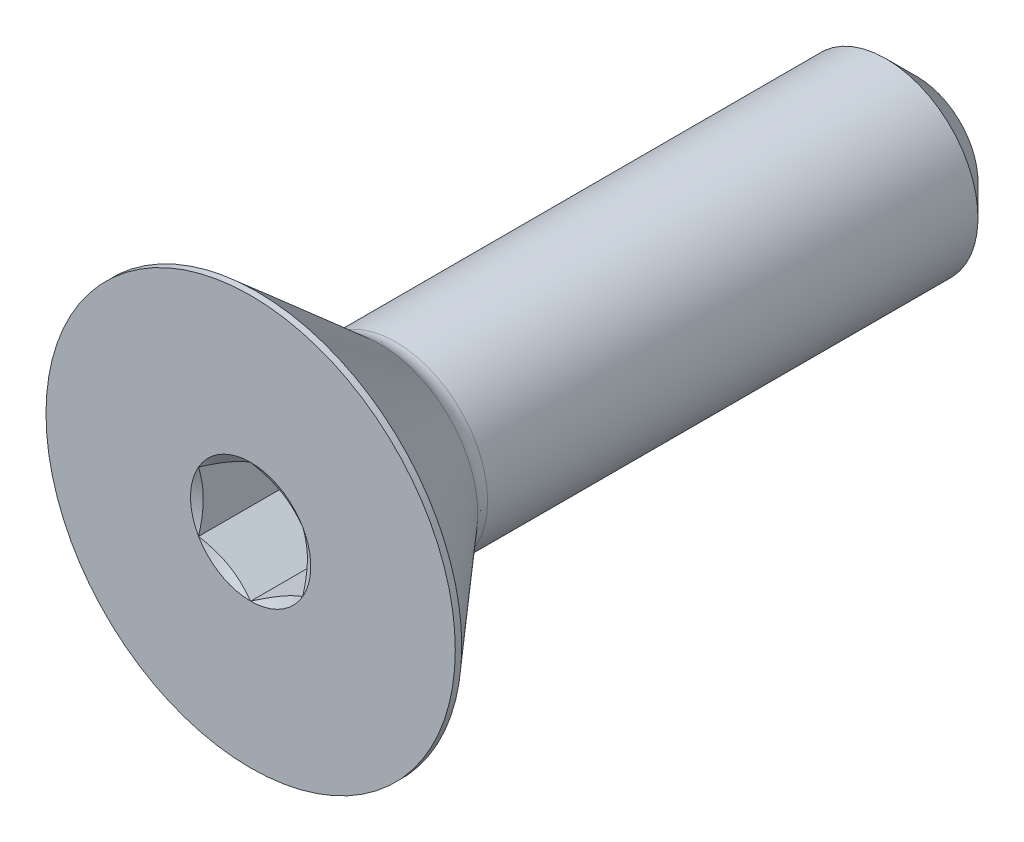
ISO-10303-21;
HEADER;
FILE_DESCRIPTION(('STEP AP214'),'2;1');
FILE_NAME('part.step','',(''),(''),'','','');
FILE_SCHEMA(('AUTOMOTIVE_DESIGN { 1 0 10303 214 1 1 1 1 }'));
ENDSEC;
DATA;
#1=APPLICATION_CONTEXT('core data for automotive mechanical design processes');
#2=APPLICATION_PROTOCOL_DEFINITION('international standard','automotive_design',2000,#1);
#3=PRODUCT_CONTEXT('',#1,'mechanical');
#4=PRODUCT('Part','Part','',(#3));
#5=PRODUCT_RELATED_PRODUCT_CATEGORY('part','',(#4));
#6=PRODUCT_DEFINITION_FORMATION('','',#4);
#7=PRODUCT_DEFINITION_CONTEXT('part definition',#1,'design');
#8=PRODUCT_DEFINITION('design','',#6,#7);
#9=PRODUCT_DEFINITION_SHAPE('','',#8);
#10=(LENGTH_UNIT() NAMED_UNIT(*) SI_UNIT(.MILLI.,.METRE.));
#11=(NAMED_UNIT(*) PLANE_ANGLE_UNIT() SI_UNIT($,.RADIAN.));
#12=(NAMED_UNIT(*) SI_UNIT($,.STERADIAN.) SOLID_ANGLE_UNIT());
#13=UNCERTAINTY_MEASURE_WITH_UNIT(LENGTH_MEASURE(1.E-05),#10,'distance_accuracy_value','');
#14=(GEOMETRIC_REPRESENTATION_CONTEXT(3) GLOBAL_UNCERTAINTY_ASSIGNED_CONTEXT((#13)) GLOBAL_UNIT_ASSIGNED_CONTEXT((#10,
#11,#12)) REPRESENTATION_CONTEXT('',''));
#15=CARTESIAN_POINT('',(0.,0.,0.));
#16=DIRECTION('',(0.,0.,1.));
#17=DIRECTION('',(1.,0.,0.));
#18=AXIS2_PLACEMENT_3D('',#15,#16,#17);
#19=CARTESIAN_POINT('',(0.,0.,-12.7));
#20=DIRECTION('',(0.,0.,-1.));
#21=DIRECTION('',(0.,1.,0.));
#22=AXIS2_PLACEMENT_3D('',#19,#20,#21);
#23=CYLINDRICAL_SURFACE('',#22,1.7526);
#24=CARTESIAN_POINT('',(0.,0.,-12.1046875));
#25=DIRECTION('',(0.,0.,-1.));
#26=DIRECTION('',(0.,1.,0.));
#27=AXIS2_PLACEMENT_3D('',#24,#25,#26);
#28=CIRCLE('',#27,1.7526);
#29=CARTESIAN_POINT('',(0.,1.7526,-12.1046875));
#30=VERTEX_POINT('',#29);
#31=EDGE_CURVE('E48',#30,#30,#28,.F.);
#32=ORIENTED_EDGE('',*,*,#31,.T.);
#33=EDGE_LOOP('',(#32));
#34=FACE_BOUND('',#33,.T.);
#35=CARTESIAN_POINT('',(0.,0.,-2.76239145005296));
#36=DIRECTION('',(0.,0.,1.));
#37=DIRECTION('',(0.,-1.,0.));
#38=AXIS2_PLACEMENT_3D('',#35,#36,#37);
#39=CIRCLE('',#38,1.7526);
#40=CARTESIAN_POINT('',(0.,-1.7526,-2.76239145005296));
#41=VERTEX_POINT('',#40);
#42=EDGE_CURVE('E207',#41,#41,#39,.T.);
#43=ORIENTED_EDGE('',*,*,#42,.F.);
#44=EDGE_LOOP('',(#43));
#45=FACE_BOUND('',#44,.T.);
#46=ADVANCED_FACE('F35',(#34,#45),#23,.T.);
#47=CARTESIAN_POINT('',(0.,-1.7526,-12.7));
#48=DIRECTION('',(0.,0.,-1.));
#49=DIRECTION('',(0.,1.,0.));
#50=AXIS2_PLACEMENT_3D('',#47,#48,#49);
#51=PLANE('',#50);
#52=CARTESIAN_POINT('',(0.,0.,-12.7));
#53=DIRECTION('',(0.,0.,-1.));
#54=DIRECTION('',(0.,1.,0.));
#55=AXIS2_PLACEMENT_3D('',#52,#53,#54);
#56=CIRCLE('',#55,1.1572875);
#57=CARTESIAN_POINT('',(0.,1.1572875,-12.7));
#58=VERTEX_POINT('',#57);
#59=EDGE_CURVE('E210',#58,#58,#56,.T.);
#60=ORIENTED_EDGE('',*,*,#59,.T.);
#61=EDGE_LOOP('',(#60));
#62=FACE_BOUND('',#61,.T.);
#63=ADVANCED_FACE('F220',(#62),#51,.T.);
#64=CARTESIAN_POINT('',(0.,0.,-12.7));
#65=DIRECTION('',(0.,0.,1.));
#66=DIRECTION('',(0.,-1.,0.));
#67=AXIS2_PLACEMENT_3D('',#64,#65,#66);
#68=CONICAL_SURFACE('',#67,1.1572875,0.785398163397447);
#69=ORIENTED_EDGE('',*,*,#31,.F.);
#70=EDGE_LOOP('',(#69));
#71=FACE_BOUND('',#70,.T.);
#72=ORIENTED_EDGE('',*,*,#59,.F.);
#73=EDGE_LOOP('',(#72));
#74=FACE_BOUND('',#73,.T.);
#75=ADVANCED_FACE('F37',(#71,#74),#68,.T.);
#76=CARTESIAN_POINT('',(0.,0.,-2.76239145005296));
#77=DIRECTION('',(0.,0.,1.));
#78=DIRECTION('',(0.,-1.,0.));
#79=AXIS2_PLACEMENT_3D('',#76,#77,#78);
#80=TOROIDAL_SURFACE('',#79,2.20772893940719,0.455128939407187);
#81=CARTESIAN_POINT('',(0.,0.,-2.4638));
#82=DIRECTION('',(0.,0.,1.));
#83=DIRECTION('',(0.,-1.,0.));
#84=AXIS2_PLACEMENT_3D('',#81,#82,#83);
#85=CIRCLE('',#84,1.86423876859996);
#86=CARTESIAN_POINT('',(0.,-1.86423876859996,-2.4638));
#87=VERTEX_POINT('',#86);
#88=EDGE_CURVE('E204',#87,#87,#85,.T.);
#89=ORIENTED_EDGE('',*,*,#88,.F.);
#90=EDGE_LOOP('',(#89));
#91=FACE_BOUND('',#90,.T.);
#92=ORIENTED_EDGE('',*,*,#42,.T.);
#93=EDGE_LOOP('',(#92));
#94=FACE_BOUND('',#93,.T.);
#95=ADVANCED_FACE('F219',(#91,#94),#80,.F.);
#96=CARTESIAN_POINT('',(0.,0.,-2.4638));
#97=DIRECTION('',(0.,0.,1.));
#98=DIRECTION('',(0.,-1.,0.));
#99=AXIS2_PLACEMENT_3D('',#96,#97,#98);
#100=CONICAL_SURFACE('',#99,1.86423876859996,0.715584993317676);
#101=CARTESIAN_POINT('',(0.,0.,-0.12319));
#102=DIRECTION('',(0.,0.,1.));
#103=DIRECTION('',(0.,-1.,0.));
#104=AXIS2_PLACEMENT_3D('',#101,#102,#103);
#105=CIRCLE('',#104,3.8989);
#106=CARTESIAN_POINT('',(0.,-3.8989,-0.123189999999998));
#107=VERTEX_POINT('',#106);
#108=EDGE_CURVE('E201',#107,#107,#105,.T.);
#109=ORIENTED_EDGE('',*,*,#108,.F.);
#110=EDGE_LOOP('',(#109));
#111=FACE_BOUND('',#110,.T.);
#112=ORIENTED_EDGE('',*,*,#88,.T.);
#113=EDGE_LOOP('',(#112));
#114=FACE_BOUND('',#113,.T.);
#115=ADVANCED_FACE('F232',(#111,#114),#100,.T.);
#116=CARTESIAN_POINT('',(0.,0.,0.));
#117=DIRECTION('',(0.,0.,1.));
#118=DIRECTION('',(0.,-1.,0.));
#119=AXIS2_PLACEMENT_3D('',#116,#117,#118);
#120=CYLINDRICAL_SURFACE('',#119,3.8989);
#121=CARTESIAN_POINT('',(0.,0.,0.));
#122=DIRECTION('',(0.,0.,1.));
#123=DIRECTION('',(0.,-1.,0.));
#124=AXIS2_PLACEMENT_3D('',#121,#122,#123);
#125=CIRCLE('',#124,3.8989);
#126=CARTESIAN_POINT('',(0.,-3.8989,0.));
#127=VERTEX_POINT('',#126);
#128=EDGE_CURVE('E189',#127,#127,#125,.T.);
#129=ORIENTED_EDGE('',*,*,#128,.F.);
#130=EDGE_LOOP('',(#129));
#131=FACE_BOUND('',#130,.T.);
#132=ORIENTED_EDGE('',*,*,#108,.T.);
#133=EDGE_LOOP('',(#132));
#134=FACE_BOUND('',#133,.T.);
#135=ADVANCED_FACE('F164',(#131,#134),#120,.T.);
#136=CARTESIAN_POINT('',(0.,-1.7526,0.));
#137=DIRECTION('',(0.,0.,1.));
#138=DIRECTION('',(0.,-1.,0.));
#139=AXIS2_PLACEMENT_3D('',#136,#137,#138);
#140=PLANE('',#139);
#141=CARTESIAN_POINT('',(0.,0.,0.));
#142=DIRECTION('',(0.,0.,1.));
#143=DIRECTION('',(1.,0.,0.));
#144=AXIS2_PLACEMENT_3D('',#141,#142,#143);
#145=CIRCLE('',#144,1.14567944042316);
#146=CARTESIAN_POINT('',(0.,-1.14567944042316,0.));
#147=VERTEX_POINT('',#146);
#148=CARTESIAN_POINT('',(0.9921875,-0.572839720211583,0.));
#149=VERTEX_POINT('',#148);
#150=EDGE_CURVE('E61',#147,#149,#145,.T.);
#151=ORIENTED_EDGE('',*,*,#150,.F.);
#152=CARTESIAN_POINT('',(-0.9921875,-0.572839720211582,0.));
#153=VERTEX_POINT('',#152);
#154=EDGE_CURVE('E133',#153,#147,#145,.T.);
#155=ORIENTED_EDGE('',*,*,#154,.F.);
#156=CARTESIAN_POINT('',(-0.992187499999999,0.572839720211584,0.));
#157=VERTEX_POINT('',#156);
#158=EDGE_CURVE('E132',#157,#153,#145,.T.);
#159=ORIENTED_EDGE('',*,*,#158,.F.);
#160=CARTESIAN_POINT('',(0.,1.14567944042316,0.));
#161=VERTEX_POINT('',#160);
#162=EDGE_CURVE('E102',#161,#157,#145,.T.);
#163=ORIENTED_EDGE('',*,*,#162,.F.);
#164=CARTESIAN_POINT('',(0.9921875,0.572839720211582,0.));
#165=VERTEX_POINT('',#164);
#166=EDGE_CURVE('E93',#165,#161,#145,.T.);
#167=ORIENTED_EDGE('',*,*,#166,.F.);
#168=EDGE_CURVE('E54',#149,#165,#145,.T.);
#169=ORIENTED_EDGE('',*,*,#168,.F.);
#170=EDGE_LOOP('',(#151,#155,#159,#163,#167,#169));
#171=FACE_BOUND('',#170,.T.);
#172=ORIENTED_EDGE('',*,*,#128,.T.);
#173=EDGE_LOOP('',(#172));
#174=FACE_BOUND('',#173,.T.);
#175=ADVANCED_FACE('F128',(#171,#174),#140,.T.);
#176=CARTESIAN_POINT('',(0.,0.,0.));
#177=DIRECTION('',(0.,0.,1.));
#178=DIRECTION('',(1.,0.,0.));
#179=AXIS2_PLACEMENT_3D('',#176,#177,#178);
#180=CONICAL_SURFACE('',#179,1.14567944042316,1.0471975511966);
#181=ORIENTED_EDGE('',*,*,#162,.T.);
#182=CARTESIAN_POINT('',(0.000199999999998221,1.145794910477,6.66767443909125E-05));
#183=CARTESIAN_POINT('',(-0.0434040073418939,1.12062012510041,-0.0144765557442307));
#184=CARTESIAN_POINT('',(-0.0873843963718651,1.0952280356549,-0.0277037008180143));
#185=CARTESIAN_POINT('',(-0.176106940520387,1.04400405090756,-0.0507932047445444));
#186=CARTESIAN_POINT('',(-0.220850673592008,1.01817124457411,-0.0606473929776081));
#187=CARTESIAN_POINT('',(-0.309783551666557,0.96682582347796,-0.0759887736243137));
#188=CARTESIAN_POINT('',(-0.353959003294554,0.941321114588963,-0.0815780388011259));
#189=CARTESIAN_POINT('',(-0.442518054903495,0.890191522303363,-0.0882537470929953));
#190=CARTESIAN_POINT('',(-0.486901332412311,0.86456682508613,-0.0893457147899865));
#191=CARTESIAN_POINT('',(-0.569853085500357,0.816674608110995,-0.0870892691005518));
#192=CARTESIAN_POINT('',(-0.608433899510617,0.794399964756616,-0.0842948942545872));
#193=CARTESIAN_POINT('',(-0.685344141327385,0.749995815940266,-0.0754336329843329));
#194=CARTESIAN_POINT('',(-0.723673302576745,0.727866464375135,-0.0693637116147992));
#195=CARTESIAN_POINT('',(-0.800742467506643,0.683370561256639,-0.0541875158030724));
#196=CARTESIAN_POINT('',(-0.839472703333924,0.661009649175981,-0.045016829227585));
#197=CARTESIAN_POINT('',(-0.916355104058664,0.616621574421608,-0.0242022626393213));
#198=CARTESIAN_POINT('',(-0.95450825601264,0.594593841870547,-0.0125632819473582));
#199=CARTESIAN_POINT('',(-0.9923875,0.572724250157745,6.66767443912652E-05));
#200=B_SPLINE_CURVE_WITH_KNOTS('',3,(#182,#183,#184,#185,#186,#187,#188,#189,#190,#191,#192,
#193,#194,#195,#196,#197,#198,#199),.UNSPECIFIED.,.F.,.F.,(4,2,2,2,2,2,2,2,4),(0.,
0.157285476252497,0.314949306777111,0.468709903890828,0.622281561568944,0.756064601398105,
0.889971810762987,1.02685159539063,1.16346218837026),.UNSPECIFIED.);
#201=EDGE_CURVE('E11',#161,#157,#200,.T.);
#202=ORIENTED_EDGE('',*,*,#201,.F.);
#203=EDGE_LOOP('',(#181,#202));
#204=FACE_BOUND('',#203,.T.);
#205=ADVANCED_FACE('F106',(#204),#180,.F.);
#206=ORIENTED_EDGE('',*,*,#158,.T.);
#207=CARTESIAN_POINT('',(-0.992187499999999,-1.48346430017253,0.368930325546189));
#208=CARTESIAN_POINT('',(-0.9921875,-1.44061781379525,0.348371934690945));
#209=CARTESIAN_POINT('',(-0.9921875,-1.39766756759392,0.328030753029211));
#210=CARTESIAN_POINT('',(-0.9921875,-1.31150268631536,0.287896531690343));
#211=CARTESIAN_POINT('',(-0.9921875,-1.26828800534353,0.268103590660051));
#212=CARTESIAN_POINT('',(-0.9921875,-1.1376654035593,0.209495583295439));
#213=CARTESIAN_POINT('',(-0.9921875,-1.04979116923791,0.171700553646544));
#214=CARTESIAN_POINT('',(-0.9921875,-0.869982745280392,0.099462650205622));
#215=CARTESIAN_POINT('',(-0.9921875,-0.778002448480644,0.0651329823098885));
#216=CARTESIAN_POINT('',(-0.9921875,-0.591672904739913,0.00404164979788768));
#217=CARTESIAN_POINT('',(-0.9921875,-0.497330517205339,-0.022739662692481));
#218=CARTESIAN_POINT('',(-0.9921875,-0.35391326780874,-0.0538006031683386));
#219=CARTESIAN_POINT('',(-0.9921875,-0.305836005647332,-0.0626317381603378));
#220=CARTESIAN_POINT('',(-0.9921875,-0.209142082644048,-0.0766539934910713));
#221=CARTESIAN_POINT('',(-0.9921875,-0.160525458478952,-0.0818453598126286));
#222=CARTESIAN_POINT('',(-0.9921875,-0.0636052204906789,-0.0881072610571045));
#223=CARTESIAN_POINT('',(-0.9921875,-0.015304835611628,-0.0892264247155386));
#224=CARTESIAN_POINT('',(-0.9921875,0.0812158614306201,-0.0873789980879148));
#225=CARTESIAN_POINT('',(-0.9921875,0.129436168450578,-0.0844121548101202));
#226=CARTESIAN_POINT('',(-0.9921875,0.248413577179174,-0.0723122901608196));
#227=CARTESIAN_POINT('',(-0.9921875,0.318940575965638,-0.0609118184029182));
#228=CARTESIAN_POINT('',(-0.9921875,0.45861787406522,-0.0315115600965223));
#229=CARTESIAN_POINT('',(-0.9921875,0.527766407778373,-0.0135038197859382));
#230=CARTESIAN_POINT('',(-0.9921875,0.666170294342292,0.0276519904532515));
#231=CARTESIAN_POINT('',(-0.9921875,0.735393231472071,0.0509063310330541));
#232=CARTESIAN_POINT('',(-0.9921875,0.872567707496048,0.100771015670793));
#233=CARTESIAN_POINT('',(-0.9921875,0.940519683120737,0.127380181669662));
#234=CARTESIAN_POINT('',(-0.9921875,1.11337840938734,0.198490998112709));
#235=CARTESIAN_POINT('',(-0.9921875,1.21759837035789,0.24464596726359));
#236=CARTESIAN_POINT('',(-0.9921875,1.42454284522826,0.34019821359486));
#237=CARTESIAN_POINT('',(-0.992187500000001,1.52726696720339,0.389596322477564));
#238=CARTESIAN_POINT('',(-0.992187500000001,1.73183062579127,0.490474472844182));
#239=CARTESIAN_POINT('',(-0.992187500000001,1.83366900986382,0.54195684219315));
#240=CARTESIAN_POINT('',(-0.992187500000001,2.0366639470767,0.646249834596405));
#241=CARTESIAN_POINT('',(-0.992187500000001,2.13782047756437,0.69906050150657));
#242=CARTESIAN_POINT('',(-0.992187500000001,2.33011825888518,0.800563330169685));
#243=CARTESIAN_POINT('',(-0.992187500000001,2.42130297685988,0.849173320580927));
#244=CARTESIAN_POINT('',(-0.992187500000001,2.60337907954477,0.946946931878095));
#245=CARTESIAN_POINT('',(-0.992187500000001,2.69427045323816,0.996110573252634));
#246=CARTESIAN_POINT('',(-0.992187500000001,2.87559632366783,1.09472729440815));
#247=CARTESIAN_POINT('',(-0.992187500000001,2.96603139445848,1.14417931992246));
#248=CARTESIAN_POINT('',(-0.992187500000001,3.14671869874461,1.24340523023877));
#249=CARTESIAN_POINT('',(-0.992187500000001,3.23697094156077,1.29317909806156));
#250=CARTESIAN_POINT('',(-0.992187500000001,3.32715749601777,1.3430709579188));
#251=B_SPLINE_CURVE_WITH_KNOTS('',3,(#207,#208,#209,#210,#211,#212,#213,#214,#215,#216,#217,
#218,#219,#220,#221,#222,#223,#224,#225,#226,#227,#228,#229,#230,#231,#232,#233,#234,#235,#236,
#237,#238,#239,#240,#241,#242,#243,#244,#245,#246,#247,#248,#249,#250),.UNSPECIFIED.,.F.,.F.,(4,
2,2,2,2,2,2,2,2,2,2,2,2,2,2,2,2,2,2,2,2,4),(0.,0.142567761042778,0.285161010315823,
0.572055955347283,0.866437149211682,1.16004485851572,1.30657539309775,1.45309602389933,
1.59786110868255,1.74263515723342,1.95651966660498,2.17066249724049,2.38961017481526,
2.60848118115061,2.95031964853992,3.29224612535337,3.63456563896214,3.97689646967438,
4.28689119497034,4.59689742999248,4.90611515197381,5.21531669175159),.UNSPECIFIED.);
#252=EDGE_CURVE('E101',#157,#153,#251,.F.);
#253=ORIENTED_EDGE('',*,*,#252,.F.);
#254=EDGE_LOOP('',(#206,#253));
#255=FACE_BOUND('',#254,.T.);
#256=ADVANCED_FACE('F260',(#255),#180,.F.);
#257=ORIENTED_EDGE('',*,*,#154,.T.);
#258=CARTESIAN_POINT('',(-0.9923875,-0.572724250157745,6.66767443909888E-05));
#259=CARTESIAN_POINT('',(-0.948783492658107,-0.597899035534332,-0.0144765557442307));
#260=CARTESIAN_POINT('',(-0.904803103628136,-0.623291124979851,-0.0277037008180143));
#261=CARTESIAN_POINT('',(-0.816080559479615,-0.674515109727188,-0.0507932047445446));
#262=CARTESIAN_POINT('',(-0.771336826407994,-0.700347916060637,-0.0606473929776083));
#263=CARTESIAN_POINT('',(-0.682403948333445,-0.751693337156786,-0.075988773624314));
#264=CARTESIAN_POINT('',(-0.638228496705448,-0.777198046045783,-0.0815780388011262));
#265=CARTESIAN_POINT('',(-0.549669445096507,-0.828327638331383,-0.0882537470929957));
#266=CARTESIAN_POINT('',(-0.50528616758769,-0.853952335548616,-0.0893457147899871));
#267=CARTESIAN_POINT('',(-0.422334414499644,-0.901844552523751,-0.0870892691005525));
#268=CARTESIAN_POINT('',(-0.383753600489384,-0.92411919587813,-0.0842948942545881));
#269=CARTESIAN_POINT('',(-0.306843358672616,-0.968523344694479,-0.0754336329843337));
#270=CARTESIAN_POINT('',(-0.268514197423255,-0.990652696259611,-0.0693637116148));
#271=CARTESIAN_POINT('',(-0.191445032493357,-1.03514859937811,-0.0541875158030731));
#272=CARTESIAN_POINT('',(-0.152714796666076,-1.05750951145876,-0.0450168292275856));
#273=CARTESIAN_POINT('',(-0.0758323959413365,-1.10189758621314,-0.024202262639322));
#274=CARTESIAN_POINT('',(-0.0376792439873597,-1.1239253187642,-0.0125632819473589));
#275=CARTESIAN_POINT('',(0.000199999999999933,-1.145794910477,6.66767443905675E-05));
#276=B_SPLINE_CURVE_WITH_KNOTS('',3,(#258,#259,#260,#261,#262,#263,#264,#265,#266,#267,#268,
#269,#270,#271,#272,#273,#274,#275),.UNSPECIFIED.,.F.,.F.,(4,2,2,2,2,2,2,2,4),(0.,
0.157285476252497,0.314949306777112,0.468709903890828,0.622281561568945,0.756064601398105,
0.889971810762987,1.02685159539063,1.16346218837027),.UNSPECIFIED.);
#277=EDGE_CURVE('E141',#153,#147,#276,.T.);
#278=ORIENTED_EDGE('',*,*,#277,.F.);
#279=EDGE_LOOP('',(#257,#278));
#280=FACE_BOUND('',#279,.T.);
#281=ADVANCED_FACE('F266',(#280),#180,.F.);
#282=ORIENTED_EDGE('',*,*,#150,.T.);
#283=CARTESIAN_POINT('',(-0.000199999999999964,-1.145794910477,6.66767443906621E-05));
#284=CARTESIAN_POINT('',(0.0434040073418921,-1.12062012510041,-0.014476555744231));
#285=CARTESIAN_POINT('',(0.0873843963718633,-1.09522803565489,-0.0277037008180146));
#286=CARTESIAN_POINT('',(0.176106940520385,-1.04400405090756,-0.0507932047445447));
#287=CARTESIAN_POINT('',(0.220850673592006,-1.01817124457411,-0.0606473929776085));
#288=CARTESIAN_POINT('',(0.309783551666555,-0.96682582347796,-0.0759887736243141));
#289=CARTESIAN_POINT('',(0.353959003294552,-0.941321114588962,-0.0815780388011263));
#290=CARTESIAN_POINT('',(0.442518054903493,-0.890191522303363,-0.0882537470929959));
#291=CARTESIAN_POINT('',(0.486901332412309,-0.864566825086129,-0.0893457147899872));
#292=CARTESIAN_POINT('',(0.569853085500356,-0.816674608110994,-0.0870892691005526));
#293=CARTESIAN_POINT('',(0.608433899510616,-0.794399964756616,-0.0842948942545879));
#294=CARTESIAN_POINT('',(0.685344141327383,-0.749995815940266,-0.0754336329843335));
#295=CARTESIAN_POINT('',(0.723673302576744,-0.727866464375135,-0.0693637116147999));
#296=CARTESIAN_POINT('',(0.800742467506642,-0.683370561256639,-0.054187515803073));
#297=CARTESIAN_POINT('',(0.839472703333923,-0.66100964917598,-0.0450168292275854));
#298=CARTESIAN_POINT('',(0.916355104058664,-0.616621574421607,-0.0242022626393216));
#299=CARTESIAN_POINT('',(0.95450825601264,-0.594593841870546,-0.0125632819473585));
#300=CARTESIAN_POINT('',(0.9923875,-0.572724250157744,6.66767443910139E-05));
#301=B_SPLINE_CURVE_WITH_KNOTS('',3,(#283,#284,#285,#286,#287,#288,#289,#290,#291,#292,#293,
#294,#295,#296,#297,#298,#299,#300),.UNSPECIFIED.,.F.,.F.,(4,2,2,2,2,2,2,2,4),(0.,
0.157285476252497,0.314949306777111,0.468709903890828,0.622281561568944,0.756064601398105,
0.889971810762988,1.02685159539063,1.16346218837027),.UNSPECIFIED.);
#302=EDGE_CURVE('E389',#147,#149,#301,.T.);
#303=ORIENTED_EDGE('',*,*,#302,.F.);
#304=EDGE_LOOP('',(#282,#303));
#305=FACE_BOUND('',#304,.T.);
#306=ADVANCED_FACE('F273',(#305),#180,.F.);
#307=ORIENTED_EDGE('',*,*,#168,.T.);
#308=CARTESIAN_POINT('',(0.9921875,-1.48346430017253,0.368930325546189));
#309=CARTESIAN_POINT('',(0.9921875,-1.44061781379525,0.348371934690945));
#310=CARTESIAN_POINT('',(0.9921875,-1.39766756759392,0.328030753029212));
#311=CARTESIAN_POINT('',(0.9921875,-1.31150268631536,0.287896531690344));
#312=CARTESIAN_POINT('',(0.9921875,-1.26828800534353,0.268103590660051));
#313=CARTESIAN_POINT('',(0.9921875,-1.1376654035593,0.209495583295439));
#314=CARTESIAN_POINT('',(0.9921875,-1.04979116923791,0.171700553646545));
#315=CARTESIAN_POINT('',(0.9921875,-0.869982745280392,0.0994626502056221));
#316=CARTESIAN_POINT('',(0.9921875,-0.778002448480644,0.0651329823098887));
#317=CARTESIAN_POINT('',(0.9921875,-0.591672904739913,0.00404164979788781));
#318=CARTESIAN_POINT('',(0.9921875,-0.497330517205339,-0.0227396626924809));
#319=CARTESIAN_POINT('',(0.9921875,-0.35391326780874,-0.0538006031683385));
#320=CARTESIAN_POINT('',(0.9921875,-0.305836005647332,-0.0626317381603376));
#321=CARTESIAN_POINT('',(0.9921875,-0.209142082644048,-0.0766539934910711));
#322=CARTESIAN_POINT('',(0.9921875,-0.160525458478952,-0.0818453598126285));
#323=CARTESIAN_POINT('',(0.9921875,-0.0636052204906791,-0.0881072610571045));
#324=CARTESIAN_POINT('',(0.9921875,-0.0153048356116282,-0.0892264247155386));
#325=CARTESIAN_POINT('',(0.9921875,0.08121586143062,-0.0873789980879148));
#326=CARTESIAN_POINT('',(0.9921875,0.129436168450578,-0.0844121548101202));
#327=CARTESIAN_POINT('',(0.9921875,0.248413577179174,-0.0723122901608197));
#328=CARTESIAN_POINT('',(0.9921875,0.318940575965638,-0.0609118184029182));
#329=CARTESIAN_POINT('',(0.9921875,0.458617874065219,-0.0315115600965224));
#330=CARTESIAN_POINT('',(0.9921875,0.527766407778372,-0.0135038197859385));
#331=CARTESIAN_POINT('',(0.9921875,0.666170294342291,0.0276519904532512));
#332=CARTESIAN_POINT('',(0.9921875,0.735393231472071,0.0509063310330539));
#333=CARTESIAN_POINT('',(0.9921875,0.872567707496048,0.100771015670793));
#334=CARTESIAN_POINT('',(0.9921875,0.940519683120737,0.127380181669661));
#335=CARTESIAN_POINT('',(0.9921875,1.11337840938734,0.198490998112709));
#336=CARTESIAN_POINT('',(0.9921875,1.21759837035789,0.24464596726359));
#337=CARTESIAN_POINT('',(0.9921875,1.42454284522826,0.340198213594859));
#338=CARTESIAN_POINT('',(0.9921875,1.52726696720339,0.389596322477563));
#339=CARTESIAN_POINT('',(0.9921875,1.73183062579127,0.490474472844182));
#340=CARTESIAN_POINT('',(0.9921875,1.83366900986382,0.54195684219315));
#341=CARTESIAN_POINT('',(0.9921875,2.0366639470767,0.646249834596404));
#342=CARTESIAN_POINT('',(0.9921875,2.13782047756437,0.699060501506569));
#343=CARTESIAN_POINT('',(0.9921875,2.33011825888518,0.800563330169684));
#344=CARTESIAN_POINT('',(0.9921875,2.42130297685987,0.849173320580926));
#345=CARTESIAN_POINT('',(0.9921875,2.60337907954477,0.946946931878093));
#346=CARTESIAN_POINT('',(0.9921875,2.69427045323816,0.996110573252632));
#347=CARTESIAN_POINT('',(0.9921875,2.87559632366782,1.09472729440815));
#348=CARTESIAN_POINT('',(0.9921875,2.96603139445848,1.14417931992245));
#349=CARTESIAN_POINT('',(0.9921875,3.1467186987446,1.24340523023876));
#350=CARTESIAN_POINT('',(0.9921875,3.23697094156077,1.29317909806156));
#351=CARTESIAN_POINT('',(0.9921875,3.32715749601776,1.3430709579188));
#352=B_SPLINE_CURVE_WITH_KNOTS('',3,(#308,#309,#310,#311,#312,#313,#314,#315,#316,#317,#318,
#319,#320,#321,#322,#323,#324,#325,#326,#327,#328,#329,#330,#331,#332,#333,#334,#335,#336,#337,
#338,#339,#340,#341,#342,#343,#344,#345,#346,#347,#348,#349,#350,#351),.UNSPECIFIED.,.F.,.F.,(4,
2,2,2,2,2,2,2,2,2,2,2,2,2,2,2,2,2,2,2,2,4),(0.,0.142567761042779,0.285161010315823,
0.572055955347284,0.866437149211683,1.16004485851572,1.30657539309775,1.45309602389933,
1.59786110868255,1.74263515723342,1.95651966660498,2.17066249724049,2.38961017481526,
2.60848118115061,2.95031964853992,3.29224612535337,3.63456563896214,3.97689646967438,
4.28689119497034,4.59689742999248,4.90611515197381,5.21531669175159),.UNSPECIFIED.);
#353=EDGE_CURVE('E118',#149,#165,#352,.T.);
#354=ORIENTED_EDGE('',*,*,#353,.F.);
#355=EDGE_LOOP('',(#307,#354));
#356=FACE_BOUND('',#355,.T.);
#357=ADVANCED_FACE('F280',(#356),#180,.F.);
#358=ORIENTED_EDGE('',*,*,#166,.T.);
#359=CARTESIAN_POINT('',(0.9923875,0.572724250157744,6.66767443907384E-05));
#360=CARTESIAN_POINT('',(0.948783492658108,0.597899035534331,-0.0144765557442309));
#361=CARTESIAN_POINT('',(0.904803103628137,0.62329112497985,-0.0277037008180145));
#362=CARTESIAN_POINT('',(0.816080559479615,0.674515109727187,-0.0507932047445448));
#363=CARTESIAN_POINT('',(0.771336826407994,0.700347916060636,-0.0606473929776087));
#364=CARTESIAN_POINT('',(0.682403948333445,0.751693337156785,-0.0759887736243144));
#365=CARTESIAN_POINT('',(0.638228496705448,0.777198046045782,-0.0815780388011266));
#366=CARTESIAN_POINT('',(0.549669445096507,0.828327638331382,-0.0882537470929961));
#367=CARTESIAN_POINT('',(0.505286167587691,0.853952335548615,-0.0893457147899874));
#368=CARTESIAN_POINT('',(0.422334414499644,0.90184455252375,-0.0870892691005529));
#369=CARTESIAN_POINT('',(0.383753600489384,0.924119195878129,-0.0842948942545884));
#370=CARTESIAN_POINT('',(0.306843358672616,0.968523344694479,-0.075433632984334));
#371=CARTESIAN_POINT('',(0.268514197423255,0.99065269625961,-0.0693637116148003));
#372=CARTESIAN_POINT('',(0.191445032493357,1.03514859937811,-0.0541875158030733));
#373=CARTESIAN_POINT('',(0.152714796666075,1.05750951145877,-0.0450168292275857));
#374=CARTESIAN_POINT('',(0.075832395941335,1.10189758621314,-0.0242022626393219));
#375=CARTESIAN_POINT('',(0.037679243987358,1.1239253187642,-0.0125632819473587));
#376=CARTESIAN_POINT('',(-0.000200000000001728,1.145794910477,6.66767443909427E-05));
#377=B_SPLINE_CURVE_WITH_KNOTS('',3,(#359,#360,#361,#362,#363,#364,#365,#366,#367,#368,#369,
#370,#371,#372,#373,#374,#375,#376),.UNSPECIFIED.,.F.,.F.,(4,2,2,2,2,2,2,2,4),(0.,
0.157285476252497,0.314949306777111,0.468709903890828,0.622281561568944,0.756064601398106,
0.889971810762989,1.02685159539063,1.16346218837027),.UNSPECIFIED.);
#378=EDGE_CURVE('E97',#165,#161,#377,.T.);
#379=ORIENTED_EDGE('',*,*,#378,.F.);
#380=EDGE_LOOP('',(#358,#379));
#381=FACE_BOUND('',#380,.T.);
#382=ADVANCED_FACE('F95',(#381),#180,.F.);
#383=CARTESIAN_POINT('',(0.,1.14567944042316,-1.72466));
#384=DIRECTION('',(0.,0.,1.));
#385=DIRECTION('',(1.,0.,0.));
#386=AXIS2_PLACEMENT_3D('',#383,#384,#385);
#387=PLANE('',#386);
#388=DIRECTION('',(-0.866025403784439,0.5,0.));
#389=VECTOR('',#388,1.);
#390=CARTESIAN_POINT('',(0.9921875,0.572839720211581,-1.72466));
#391=LINE('',#390,#389);
#392=CARTESIAN_POINT('',(0.9921875,0.572839720211581,-1.72466));
#393=VERTEX_POINT('',#392);
#394=CARTESIAN_POINT('',(0.,1.14567944042316,-1.72466));
#395=VERTEX_POINT('',#394);
#396=EDGE_CURVE('E117',#393,#395,#391,.T.);
#397=ORIENTED_EDGE('',*,*,#396,.T.);
#398=DIRECTION('',(-0.866025403784439,-0.5,0.));
#399=VECTOR('',#398,1.);
#400=CARTESIAN_POINT('',(0.,1.14567944042316,-1.72466));
#401=LINE('',#400,#399);
#402=CARTESIAN_POINT('',(-0.9921875,0.572839720211583,-1.72466));
#403=VERTEX_POINT('',#402);
#404=EDGE_CURVE('E122',#395,#403,#401,.T.);
#405=ORIENTED_EDGE('',*,*,#404,.T.);
#406=DIRECTION('',(0.,-1.,0.));
#407=VECTOR('',#406,1.);
#408=CARTESIAN_POINT('',(-0.9921875,0.572839720211583,-1.72466));
#409=LINE('',#408,#407);
#410=CARTESIAN_POINT('',(-0.9921875,-0.572839720211582,-1.72466));
#411=VERTEX_POINT('',#410);
#412=EDGE_CURVE('E177',#403,#411,#409,.T.);
#413=ORIENTED_EDGE('',*,*,#412,.T.);
#414=DIRECTION('',(0.866025403784439,-0.499999999999999,0.));
#415=VECTOR('',#414,1.);
#416=CARTESIAN_POINT('',(-0.9921875,-0.572839720211582,-1.72466));
#417=LINE('',#416,#415);
#418=CARTESIAN_POINT('',(0.,-1.14567944042316,-1.72466));
#419=VERTEX_POINT('',#418);
#420=EDGE_CURVE('E180',#411,#419,#417,.T.);
#421=ORIENTED_EDGE('',*,*,#420,.T.);
#422=DIRECTION('',(0.866025403784439,0.499999999999999,0.));
#423=VECTOR('',#422,1.);
#424=CARTESIAN_POINT('',(0.,-1.14567944042316,-1.72466));
#425=LINE('',#424,#423);
#426=CARTESIAN_POINT('',(0.9921875,-0.572839720211582,-1.72466));
#427=VERTEX_POINT('',#426);
#428=EDGE_CURVE('E183',#419,#427,#425,.T.);
#429=ORIENTED_EDGE('',*,*,#428,.T.);
#430=DIRECTION('',(0.,1.,0.));
#431=VECTOR('',#430,1.);
#432=CARTESIAN_POINT('',(0.9921875,-0.572839720211582,-1.72466));
#433=LINE('',#432,#431);
#434=EDGE_CURVE('E125',#427,#393,#433,.T.);
#435=ORIENTED_EDGE('',*,*,#434,.T.);
#436=EDGE_LOOP('',(#397,#405,#413,#421,#429,#435));
#437=FACE_BOUND('',#436,.T.);
#438=ADVANCED_FACE('F159',(#437),#387,.T.);
#439=CARTESIAN_POINT('',(0.,1.14567944042316,-1.72466));
#440=DIRECTION('',(-0.5,0.866025403784439,0.));
#441=DIRECTION('',(-0.866025403784439,-0.5,0.));
#442=AXIS2_PLACEMENT_3D('',#439,#440,#441);
#443=PLANE('',#442);
#444=DIRECTION('',(0.,0.,1.));
#445=VECTOR('',#444,1.);
#446=CARTESIAN_POINT('',(0.,1.14567944042316,-1.72466));
#447=LINE('',#446,#445);
#448=EDGE_CURVE('E114',#395,#161,#447,.T.);
#449=ORIENTED_EDGE('',*,*,#448,.T.);
#450=ORIENTED_EDGE('',*,*,#201,.T.);
#451=DIRECTION('',(0.,0.,1.));
#452=VECTOR('',#451,1.);
#453=CARTESIAN_POINT('',(-0.9921875,0.572839720211583,-1.72466));
#454=LINE('',#453,#452);
#455=EDGE_CURVE('E124',#403,#157,#454,.T.);
#456=ORIENTED_EDGE('',*,*,#455,.F.);
#457=ORIENTED_EDGE('',*,*,#404,.F.);
#458=EDGE_LOOP('',(#449,#450,#456,#457));
#459=FACE_BOUND('',#458,.T.);
#460=ADVANCED_FACE('F120',(#459),#443,.F.);
#461=CARTESIAN_POINT('',(-0.9921875,0.572839720211583,-1.72466));
#462=DIRECTION('',(-1.,0.,0.));
#463=DIRECTION('',(0.,-1.,0.));
#464=AXIS2_PLACEMENT_3D('',#461,#462,#463);
#465=PLANE('',#464);
#466=ORIENTED_EDGE('',*,*,#455,.T.);
#467=ORIENTED_EDGE('',*,*,#252,.T.);
#468=DIRECTION('',(0.,0.,1.));
#469=VECTOR('',#468,1.);
#470=CARTESIAN_POINT('',(-0.9921875,-0.572839720211582,-1.72466));
#471=LINE('',#470,#469);
#472=EDGE_CURVE('E196',#411,#153,#471,.T.);
#473=ORIENTED_EDGE('',*,*,#472,.F.);
#474=ORIENTED_EDGE('',*,*,#412,.F.);
#475=EDGE_LOOP('',(#466,#467,#473,#474));
#476=FACE_BOUND('',#475,.T.);
#477=ADVANCED_FACE('F149',(#476),#465,.F.);
#478=CARTESIAN_POINT('',(-0.9921875,-0.572839720211582,-1.72466));
#479=DIRECTION('',(-0.499999999999999,-0.866025403784439,0.));
#480=DIRECTION('',(0.866025403784439,-0.499999999999999,0.));
#481=AXIS2_PLACEMENT_3D('',#478,#479,#480);
#482=PLANE('',#481);
#483=ORIENTED_EDGE('',*,*,#472,.T.);
#484=ORIENTED_EDGE('',*,*,#277,.T.);
#485=DIRECTION('',(0.,0.,1.));
#486=VECTOR('',#485,1.);
#487=CARTESIAN_POINT('',(0.,-1.14567944042316,-1.72466));
#488=LINE('',#487,#486);
#489=EDGE_CURVE('E193',#419,#147,#488,.T.);
#490=ORIENTED_EDGE('',*,*,#489,.F.);
#491=ORIENTED_EDGE('',*,*,#420,.F.);
#492=EDGE_LOOP('',(#483,#484,#490,#491));
#493=FACE_BOUND('',#492,.T.);
#494=ADVANCED_FACE('F152',(#493),#482,.F.);
#495=CARTESIAN_POINT('',(0.,-1.14567944042316,-1.72466));
#496=DIRECTION('',(0.499999999999999,-0.866025403784439,0.));
#497=DIRECTION('',(0.866025403784439,0.5,0.));
#498=AXIS2_PLACEMENT_3D('',#495,#496,#497);
#499=PLANE('',#498);
#500=ORIENTED_EDGE('',*,*,#489,.T.);
#501=ORIENTED_EDGE('',*,*,#302,.T.);
#502=DIRECTION('',(0.,0.,1.));
#503=VECTOR('',#502,1.);
#504=CARTESIAN_POINT('',(0.9921875,-0.572839720211582,-1.72466));
#505=LINE('',#504,#503);
#506=EDGE_CURVE('E190',#427,#149,#505,.T.);
#507=ORIENTED_EDGE('',*,*,#506,.F.);
#508=ORIENTED_EDGE('',*,*,#428,.F.);
#509=EDGE_LOOP('',(#500,#501,#507,#508));
#510=FACE_BOUND('',#509,.T.);
#511=ADVANCED_FACE('F309',(#510),#499,.F.);
#512=CARTESIAN_POINT('',(0.9921875,-0.572839720211582,-1.72466));
#513=DIRECTION('',(1.,0.,0.));
#514=DIRECTION('',(0.,0.,-1.));
#515=AXIS2_PLACEMENT_3D('',#512,#513,#514);
#516=PLANE('',#515);
#517=ORIENTED_EDGE('',*,*,#506,.T.);
#518=ORIENTED_EDGE('',*,*,#353,.T.);
#519=DIRECTION('',(0.,0.,1.));
#520=VECTOR('',#519,1.);
#521=CARTESIAN_POINT('',(0.9921875,0.572839720211581,-1.72466));
#522=LINE('',#521,#520);
#523=EDGE_CURVE('E116',#393,#165,#522,.T.);
#524=ORIENTED_EDGE('',*,*,#523,.F.);
#525=ORIENTED_EDGE('',*,*,#434,.F.);
#526=EDGE_LOOP('',(#517,#518,#524,#525));
#527=FACE_BOUND('',#526,.T.);
#528=ADVANCED_FACE('F163',(#527),#516,.F.);
#529=CARTESIAN_POINT('',(0.9921875,0.572839720211581,-1.72466));
#530=DIRECTION('',(0.5,0.866025403784439,0.));
#531=DIRECTION('',(-0.866025403784439,0.5,0.));
#532=AXIS2_PLACEMENT_3D('',#529,#530,#531);
#533=PLANE('',#532);
#534=ORIENTED_EDGE('',*,*,#523,.T.);
#535=ORIENTED_EDGE('',*,*,#378,.T.);
#536=ORIENTED_EDGE('',*,*,#448,.F.);
#537=ORIENTED_EDGE('',*,*,#396,.F.);
#538=EDGE_LOOP('',(#534,#535,#536,#537));
#539=FACE_BOUND('',#538,.T.);
#540=ADVANCED_FACE('F112',(#539),#533,.F.);
#541=CLOSED_SHELL('',(#46,#63,#75,#95,#115,#135,#175,#205,#256,#281,#306,#357,#382,#438,#460,
#477,#494,#511,#528,#540));
#542=MANIFOLD_SOLID_BREP('B2',#541);
#543=ADVANCED_BREP_SHAPE_REPRESENTATION('',(#18,#542),#14);
#544=SHAPE_DEFINITION_REPRESENTATION(#9,#543);
ENDSEC;
END-ISO-10303-21;
